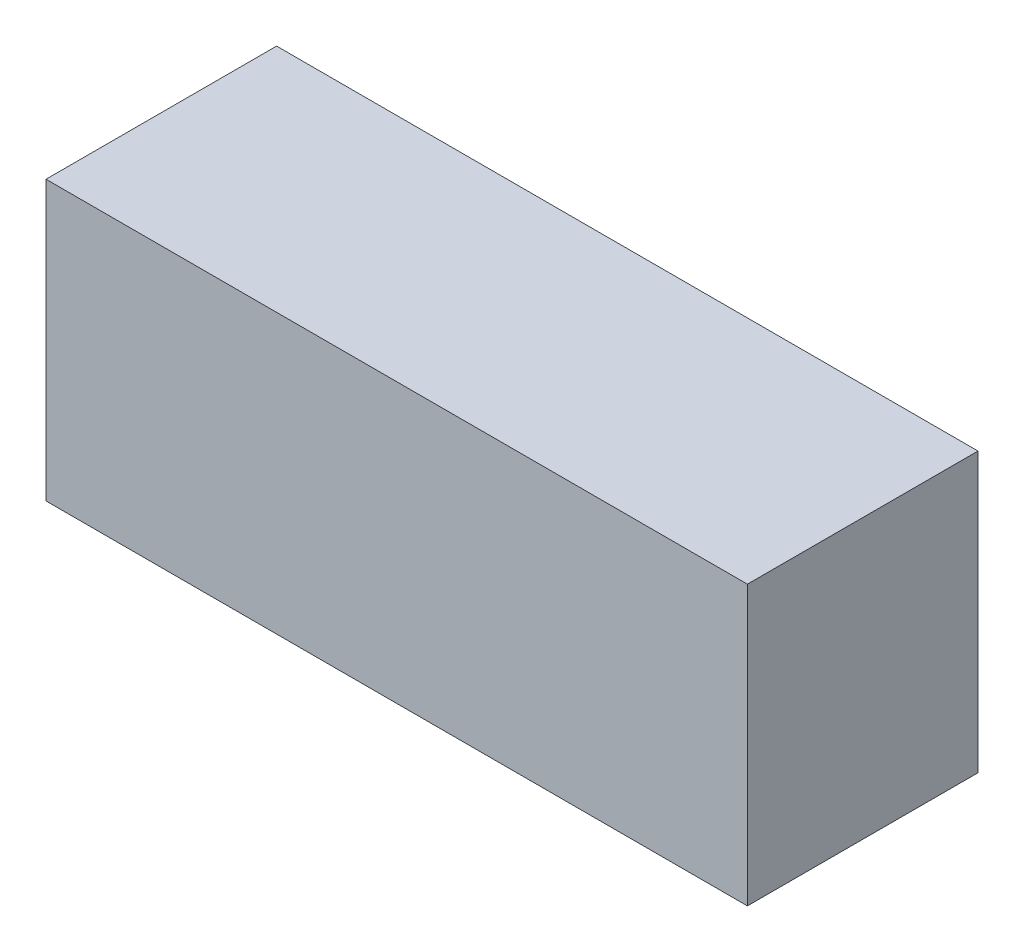
ISO-10303-21;
HEADER;
FILE_DESCRIPTION(('STEP AP214'),'2;1');
FILE_NAME('part.step','',(''),(''),'','','');
FILE_SCHEMA(('AUTOMOTIVE_DESIGN { 1 0 10303 214 1 1 1 1 }'));
ENDSEC;
DATA;
#1=APPLICATION_CONTEXT('core data for automotive mechanical design processes');
#2=APPLICATION_PROTOCOL_DEFINITION('international standard','automotive_design',2000,#1);
#3=PRODUCT_CONTEXT('',#1,'mechanical');
#4=PRODUCT('Part','Part','',(#3));
#5=PRODUCT_RELATED_PRODUCT_CATEGORY('part','',(#4));
#6=PRODUCT_DEFINITION_FORMATION('','',#4);
#7=PRODUCT_DEFINITION_CONTEXT('part definition',#1,'design');
#8=PRODUCT_DEFINITION('design','',#6,#7);
#9=PRODUCT_DEFINITION_SHAPE('','',#8);
#10=(LENGTH_UNIT() NAMED_UNIT(*) SI_UNIT(.MILLI.,.METRE.));
#11=(NAMED_UNIT(*) PLANE_ANGLE_UNIT() SI_UNIT($,.RADIAN.));
#12=(NAMED_UNIT(*) SI_UNIT($,.STERADIAN.) SOLID_ANGLE_UNIT());
#13=UNCERTAINTY_MEASURE_WITH_UNIT(LENGTH_MEASURE(1.E-05),#10,'distance_accuracy_value','');
#14=(GEOMETRIC_REPRESENTATION_CONTEXT(3) GLOBAL_UNCERTAINTY_ASSIGNED_CONTEXT((#13)) GLOBAL_UNIT_ASSIGNED_CONTEXT((#10,
#11,#12)) REPRESENTATION_CONTEXT('',''));
#15=CARTESIAN_POINT('',(0.,0.,0.));
#16=DIRECTION('',(0.,0.,1.));
#17=DIRECTION('',(1.,0.,0.));
#18=AXIS2_PLACEMENT_3D('',#15,#16,#17);
#19=CARTESIAN_POINT('',(3.65,2.9,1.2));
#20=DIRECTION('',(-1.,0.,0.));
#21=DIRECTION('',(0.,0.,1.));
#22=AXIS2_PLACEMENT_3D('',#19,#20,#21);
#23=PLANE('',#22);
#24=DIRECTION('',(0.,0.,-1.));
#25=VECTOR('',#24,1.);
#26=CARTESIAN_POINT('',(3.65,0.,1.2));
#27=LINE('',#26,#25);
#28=CARTESIAN_POINT('',(3.65,0.,1.2));
#29=VERTEX_POINT('',#28);
#30=CARTESIAN_POINT('',(3.65,0.,-1.2));
#31=VERTEX_POINT('',#30);
#32=EDGE_CURVE('E93',#29,#31,#27,.T.);
#33=ORIENTED_EDGE('',*,*,#32,.T.);
#34=DIRECTION('',(0.,-1.,0.));
#35=VECTOR('',#34,1.);
#36=CARTESIAN_POINT('',(3.65,2.9,-1.2));
#37=LINE('',#36,#35);
#38=CARTESIAN_POINT('',(3.65,2.9,-1.2));
#39=VERTEX_POINT('',#38);
#40=EDGE_CURVE('E11',#39,#31,#37,.T.);
#41=ORIENTED_EDGE('',*,*,#40,.F.);
#42=DIRECTION('',(0.,0.,-1.));
#43=VECTOR('',#42,1.);
#44=CARTESIAN_POINT('',(3.65,2.9,1.2));
#45=LINE('',#44,#43);
#46=CARTESIAN_POINT('',(3.65,2.9,1.2));
#47=VERTEX_POINT('',#46);
#48=EDGE_CURVE('E81',#47,#39,#45,.T.);
#49=ORIENTED_EDGE('',*,*,#48,.F.);
#50=DIRECTION('',(0.,-1.,0.));
#51=VECTOR('',#50,1.);
#52=CARTESIAN_POINT('',(3.65,2.9,1.2));
#53=LINE('',#52,#51);
#54=EDGE_CURVE('E89',#47,#29,#53,.T.);
#55=ORIENTED_EDGE('',*,*,#54,.T.);
#56=EDGE_LOOP('',(#33,#41,#49,#55));
#57=FACE_BOUND('',#56,.T.);
#58=ADVANCED_FACE('F30',(#57),#23,.F.);
#59=CARTESIAN_POINT('',(-3.65,2.9,-1.2));
#60=DIRECTION('',(0.,0.,1.));
#61=DIRECTION('',(1.,0.,0.));
#62=AXIS2_PLACEMENT_3D('',#59,#60,#61);
#63=PLANE('',#62);
#64=DIRECTION('',(-1.,0.,0.));
#65=VECTOR('',#64,1.);
#66=CARTESIAN_POINT('',(-3.65,0.,-1.2));
#67=LINE('',#66,#65);
#68=CARTESIAN_POINT('',(-3.65,0.,-1.2));
#69=VERTEX_POINT('',#68);
#70=EDGE_CURVE('E85',#31,#69,#67,.T.);
#71=ORIENTED_EDGE('',*,*,#70,.T.);
#72=DIRECTION('',(0.,-1.,0.));
#73=VECTOR('',#72,1.);
#74=CARTESIAN_POINT('',(-3.65,2.9,-1.2));
#75=LINE('',#74,#73);
#76=CARTESIAN_POINT('',(-3.65,2.9,-1.2));
#77=VERTEX_POINT('',#76);
#78=EDGE_CURVE('E38',#77,#69,#75,.T.);
#79=ORIENTED_EDGE('',*,*,#78,.F.);
#80=DIRECTION('',(-1.,0.,0.));
#81=VECTOR('',#80,1.);
#82=CARTESIAN_POINT('',(-3.65,2.9,-1.2));
#83=LINE('',#82,#81);
#84=EDGE_CURVE('E76',#39,#77,#83,.T.);
#85=ORIENTED_EDGE('',*,*,#84,.F.);
#86=ORIENTED_EDGE('',*,*,#40,.T.);
#87=EDGE_LOOP('',(#71,#79,#85,#86));
#88=FACE_BOUND('',#87,.T.);
#89=ADVANCED_FACE('F84',(#88),#63,.F.);
#90=CARTESIAN_POINT('',(-3.65,2.9,1.2));
#91=DIRECTION('',(1.,0.,0.));
#92=DIRECTION('',(0.,0.,-1.));
#93=AXIS2_PLACEMENT_3D('',#90,#91,#92);
#94=PLANE('',#93);
#95=DIRECTION('',(0.,0.,1.));
#96=VECTOR('',#95,1.);
#97=CARTESIAN_POINT('',(-3.65,0.,1.2));
#98=LINE('',#97,#96);
#99=CARTESIAN_POINT('',(-3.65,0.,1.2));
#100=VERTEX_POINT('',#99);
#101=EDGE_CURVE('E63',#69,#100,#98,.T.);
#102=ORIENTED_EDGE('',*,*,#101,.T.);
#103=DIRECTION('',(0.,-1.,0.));
#104=VECTOR('',#103,1.);
#105=CARTESIAN_POINT('',(-3.65,2.9,1.2));
#106=LINE('',#105,#104);
#107=CARTESIAN_POINT('',(-3.65,2.9,1.2));
#108=VERTEX_POINT('',#107);
#109=EDGE_CURVE('E86',#108,#100,#106,.T.);
#110=ORIENTED_EDGE('',*,*,#109,.F.);
#111=DIRECTION('',(0.,0.,1.));
#112=VECTOR('',#111,1.);
#113=CARTESIAN_POINT('',(-3.65,2.9,1.2));
#114=LINE('',#113,#112);
#115=EDGE_CURVE('E79',#77,#108,#114,.T.);
#116=ORIENTED_EDGE('',*,*,#115,.F.);
#117=ORIENTED_EDGE('',*,*,#78,.T.);
#118=EDGE_LOOP('',(#102,#110,#116,#117));
#119=FACE_BOUND('',#118,.T.);
#120=ADVANCED_FACE('F87',(#119),#94,.F.);
#121=CARTESIAN_POINT('',(-3.65,2.9,1.2));
#122=DIRECTION('',(0.,0.,-1.));
#123=DIRECTION('',(-1.,0.,0.));
#124=AXIS2_PLACEMENT_3D('',#121,#122,#123);
#125=PLANE('',#124);
#126=DIRECTION('',(1.,0.,0.));
#127=VECTOR('',#126,1.);
#128=CARTESIAN_POINT('',(-3.65,0.,1.2));
#129=LINE('',#128,#127);
#130=EDGE_CURVE('E69',#100,#29,#129,.T.);
#131=ORIENTED_EDGE('',*,*,#130,.T.);
#132=ORIENTED_EDGE('',*,*,#54,.F.);
#133=DIRECTION('',(1.,0.,0.));
#134=VECTOR('',#133,1.);
#135=CARTESIAN_POINT('',(-3.65,2.9,1.2));
#136=LINE('',#135,#134);
#137=EDGE_CURVE('E46',#108,#47,#136,.T.);
#138=ORIENTED_EDGE('',*,*,#137,.F.);
#139=ORIENTED_EDGE('',*,*,#109,.T.);
#140=EDGE_LOOP('',(#131,#132,#138,#139));
#141=FACE_BOUND('',#140,.T.);
#142=ADVANCED_FACE('F100',(#141),#125,.F.);
#143=CARTESIAN_POINT('',(3.65,2.9,-1.2));
#144=DIRECTION('',(0.,-1.,0.));
#145=DIRECTION('',(0.,0.,-1.));
#146=AXIS2_PLACEMENT_3D('',#143,#144,#145);
#147=PLANE('',#146);
#148=ORIENTED_EDGE('',*,*,#48,.T.);
#149=ORIENTED_EDGE('',*,*,#84,.T.);
#150=ORIENTED_EDGE('',*,*,#115,.T.);
#151=ORIENTED_EDGE('',*,*,#137,.T.);
#152=EDGE_LOOP('',(#148,#149,#150,#151));
#153=FACE_BOUND('',#152,.T.);
#154=ADVANCED_FACE('F77',(#153),#147,.F.);
#155=CARTESIAN_POINT('',(3.65,0.,-1.2));
#156=DIRECTION('',(0.,-1.,0.));
#157=DIRECTION('',(0.,0.,-1.));
#158=AXIS2_PLACEMENT_3D('',#155,#156,#157);
#159=PLANE('',#158);
#160=ORIENTED_EDGE('',*,*,#32,.F.);
#161=ORIENTED_EDGE('',*,*,#130,.F.);
#162=ORIENTED_EDGE('',*,*,#101,.F.);
#163=ORIENTED_EDGE('',*,*,#70,.F.);
#164=EDGE_LOOP('',(#160,#161,#162,#163));
#165=FACE_BOUND('',#164,.T.);
#166=ADVANCED_FACE('F103',(#165),#159,.T.);
#167=CLOSED_SHELL('',(#58,#89,#120,#142,#154,#166));
#168=MANIFOLD_SOLID_BREP('B2',#167);
#169=ADVANCED_BREP_SHAPE_REPRESENTATION('',(#18,#168),#14);
#170=SHAPE_DEFINITION_REPRESENTATION(#9,#169);
ENDSEC;
END-ISO-10303-21;
